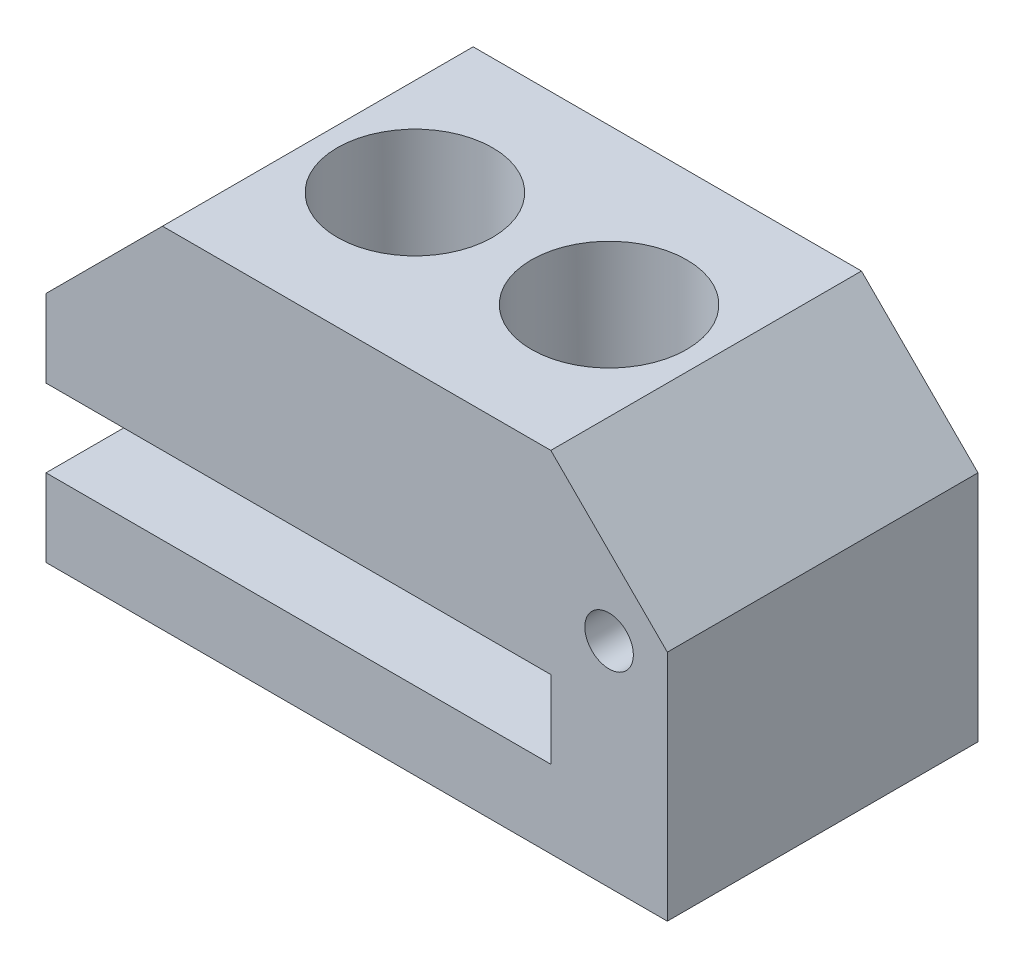
ISO-10303-21;
HEADER;
FILE_DESCRIPTION(('STEP AP214'),'2;1');
FILE_NAME('part.step','',(''),(''),'','','');
FILE_SCHEMA(('AUTOMOTIVE_DESIGN { 1 0 10303 214 1 1 1 1 }'));
ENDSEC;
DATA;
#1=APPLICATION_CONTEXT('core data for automotive mechanical design processes');
#2=APPLICATION_PROTOCOL_DEFINITION('international standard','automotive_design',2000,#1);
#3=PRODUCT_CONTEXT('',#1,'mechanical');
#4=PRODUCT('Part','Part','',(#3));
#5=PRODUCT_RELATED_PRODUCT_CATEGORY('part','',(#4));
#6=PRODUCT_DEFINITION_FORMATION('','',#4);
#7=PRODUCT_DEFINITION_CONTEXT('part definition',#1,'design');
#8=PRODUCT_DEFINITION('design','',#6,#7);
#9=PRODUCT_DEFINITION_SHAPE('','',#8);
#10=(LENGTH_UNIT() NAMED_UNIT(*) SI_UNIT(.MILLI.,.METRE.));
#11=(NAMED_UNIT(*) PLANE_ANGLE_UNIT() SI_UNIT($,.RADIAN.));
#12=(NAMED_UNIT(*) SI_UNIT($,.STERADIAN.) SOLID_ANGLE_UNIT());
#13=UNCERTAINTY_MEASURE_WITH_UNIT(LENGTH_MEASURE(1.E-05),#10,'distance_accuracy_value','');
#14=(GEOMETRIC_REPRESENTATION_CONTEXT(3) GLOBAL_UNCERTAINTY_ASSIGNED_CONTEXT((#13)) GLOBAL_UNIT_ASSIGNED_CONTEXT((#10,
#11,#12)) REPRESENTATION_CONTEXT('',''));
#15=CARTESIAN_POINT('',(0.,0.,0.));
#16=DIRECTION('',(0.,0.,1.));
#17=DIRECTION('',(1.,0.,0.));
#18=AXIS2_PLACEMENT_3D('',#15,#16,#17);
#19=CARTESIAN_POINT('',(0.,12.,16.));
#20=DIRECTION('',(1.,0.,0.));
#21=DIRECTION('',(0.,0.,-1.));
#22=AXIS2_PLACEMENT_3D('',#19,#20,#21);
#23=PLANE('',#22);
#24=DIRECTION('',(0.,0.,1.));
#25=VECTOR('',#24,1.);
#26=CARTESIAN_POINT('',(0.,4.,-40.));
#27=LINE('',#26,#25);
#28=CARTESIAN_POINT('',(0.,4.,0.));
#29=VERTEX_POINT('',#28);
#30=CARTESIAN_POINT('',(0.,4.,16.));
#31=VERTEX_POINT('',#30);
#32=EDGE_CURVE('E236',#29,#31,#27,.T.);
#33=ORIENTED_EDGE('',*,*,#32,.F.);
#34=DIRECTION('',(0.,-1.,0.));
#35=VECTOR('',#34,1.);
#36=CARTESIAN_POINT('',(0.,12.,0.));
#37=LINE('',#36,#35);
#38=CARTESIAN_POINT('',(0.,0.,0.));
#39=VERTEX_POINT('',#38);
#40=EDGE_CURVE('E145',#29,#39,#37,.T.);
#41=ORIENTED_EDGE('',*,*,#40,.T.);
#42=DIRECTION('',(0.,0.,-1.));
#43=VECTOR('',#42,1.);
#44=CARTESIAN_POINT('',(0.,0.,16.));
#45=LINE('',#44,#43);
#46=CARTESIAN_POINT('',(0.,0.,16.));
#47=VERTEX_POINT('',#46);
#48=EDGE_CURVE('E49',#47,#39,#45,.T.);
#49=ORIENTED_EDGE('',*,*,#48,.F.);
#50=DIRECTION('',(0.,-1.,0.));
#51=VECTOR('',#50,1.);
#52=CARTESIAN_POINT('',(0.,12.,16.));
#53=LINE('',#52,#51);
#54=EDGE_CURVE('E101',#31,#47,#53,.T.);
#55=ORIENTED_EDGE('',*,*,#54,.F.);
#56=EDGE_LOOP('',(#33,#41,#49,#55));
#57=FACE_BOUND('',#56,.T.);
#58=ADVANCED_FACE('F41',(#57),#23,.F.);
#59=CARTESIAN_POINT('',(21.,-40.,8.));
#60=DIRECTION('',(0.,1.,0.));
#61=DIRECTION('',(0.,0.,1.));
#62=AXIS2_PLACEMENT_3D('',#59,#60,#61);
#63=CYLINDRICAL_SURFACE('',#62,4.);
#64=CARTESIAN_POINT('',(21.,8.,8.));
#65=DIRECTION('',(0.,1.,0.));
#66=DIRECTION('',(0.,0.,1.));
#67=AXIS2_PLACEMENT_3D('',#64,#65,#66);
#68=CIRCLE('',#67,4.);
#69=CARTESIAN_POINT('',(21.,8.,12.));
#70=VERTEX_POINT('',#69);
#71=EDGE_CURVE('E178',#70,#70,#68,.F.);
#72=ORIENTED_EDGE('',*,*,#71,.T.);
#73=EDGE_LOOP('',(#72));
#74=FACE_BOUND('',#73,.T.);
#75=CARTESIAN_POINT('',(21.,18.,8.));
#76=DIRECTION('',(0.,-1.,0.));
#77=DIRECTION('',(0.,0.,-1.));
#78=AXIS2_PLACEMENT_3D('',#75,#76,#77);
#79=CIRCLE('',#78,4.);
#80=CARTESIAN_POINT('',(21.,18.,4.));
#81=VERTEX_POINT('',#80);
#82=EDGE_CURVE('E159',#81,#81,#79,.T.);
#83=ORIENTED_EDGE('',*,*,#82,.F.);
#84=EDGE_LOOP('',(#83));
#85=FACE_BOUND('',#84,.T.);
#86=ADVANCED_FACE('F269',(#74,#85),#63,.F.);
#87=CARTESIAN_POINT('',(11.,-40.,8.));
#88=DIRECTION('',(0.,1.,0.));
#89=DIRECTION('',(0.,0.,1.));
#90=AXIS2_PLACEMENT_3D('',#87,#88,#89);
#91=CYLINDRICAL_SURFACE('',#90,4.);
#92=CARTESIAN_POINT('',(11.,8.,8.));
#93=DIRECTION('',(0.,1.,0.));
#94=DIRECTION('',(0.,0.,1.));
#95=AXIS2_PLACEMENT_3D('',#92,#93,#94);
#96=CIRCLE('',#95,4.);
#97=CARTESIAN_POINT('',(11.,8.,12.));
#98=VERTEX_POINT('',#97);
#99=EDGE_CURVE('E173',#98,#98,#96,.F.);
#100=ORIENTED_EDGE('',*,*,#99,.T.);
#101=EDGE_LOOP('',(#100));
#102=FACE_BOUND('',#101,.T.);
#103=CARTESIAN_POINT('',(11.,18.,8.));
#104=DIRECTION('',(0.,-1.,0.));
#105=DIRECTION('',(0.,0.,-1.));
#106=AXIS2_PLACEMENT_3D('',#103,#104,#105);
#107=CIRCLE('',#106,4.);
#108=CARTESIAN_POINT('',(11.,18.,4.));
#109=VERTEX_POINT('',#108);
#110=EDGE_CURVE('E164',#109,#109,#107,.T.);
#111=ORIENTED_EDGE('',*,*,#110,.F.);
#112=EDGE_LOOP('',(#111));
#113=FACE_BOUND('',#112,.T.);
#114=ADVANCED_FACE('F274',(#102,#113),#91,.F.);
#115=CARTESIAN_POINT('',(0.,12.,0.));
#116=VERTEX_POINT('',#115);
#117=CARTESIAN_POINT('',(0.,8.,0.));
#118=VERTEX_POINT('',#117);
#119=EDGE_CURVE('E137',#116,#118,#37,.T.);
#120=ORIENTED_EDGE('',*,*,#119,.T.);
#121=DIRECTION('',(0.,0.,1.));
#122=VECTOR('',#121,1.);
#123=CARTESIAN_POINT('',(0.,8.,-40.));
#124=LINE('',#123,#122);
#125=CARTESIAN_POINT('',(0.,8.,16.));
#126=VERTEX_POINT('',#125);
#127=EDGE_CURVE('E174',#118,#126,#124,.T.);
#128=ORIENTED_EDGE('',*,*,#127,.T.);
#129=CARTESIAN_POINT('',(0.,12.,16.));
#130=VERTEX_POINT('',#129);
#131=EDGE_CURVE('E205',#130,#126,#53,.T.);
#132=ORIENTED_EDGE('',*,*,#131,.F.);
#133=DIRECTION('',(0.,0.,-1.));
#134=VECTOR('',#133,1.);
#135=CARTESIAN_POINT('',(0.,12.,16.));
#136=LINE('',#135,#134);
#137=EDGE_CURVE('E138',#130,#116,#136,.T.);
#138=ORIENTED_EDGE('',*,*,#137,.T.);
#139=EDGE_LOOP('',(#120,#128,#132,#138));
#140=FACE_BOUND('',#139,.T.);
#141=ADVANCED_FACE('F43',(#140),#23,.F.);
#142=CARTESIAN_POINT('',(0.,0.,16.));
#143=DIRECTION('',(0.,1.,0.));
#144=DIRECTION('',(0.,0.,1.));
#145=AXIS2_PLACEMENT_3D('',#142,#143,#144);
#146=PLANE('',#145);
#147=CARTESIAN_POINT('',(11.,0.,8.));
#148=DIRECTION('',(0.,1.,0.));
#149=DIRECTION('',(0.,0.,1.));
#150=AXIS2_PLACEMENT_3D('',#147,#148,#149);
#151=CIRCLE('',#150,4.);
#152=CARTESIAN_POINT('',(11.,0.,12.));
#153=VERTEX_POINT('',#152);
#154=EDGE_CURVE('E169',#153,#153,#151,.T.);
#155=ORIENTED_EDGE('',*,*,#154,.T.);
#156=EDGE_LOOP('',(#155));
#157=FACE_BOUND('',#156,.T.);
#158=CARTESIAN_POINT('',(21.,0.,8.));
#159=DIRECTION('',(0.,1.,0.));
#160=DIRECTION('',(0.,0.,1.));
#161=AXIS2_PLACEMENT_3D('',#158,#159,#160);
#162=CIRCLE('',#161,4.);
#163=CARTESIAN_POINT('',(21.,0.,12.));
#164=VERTEX_POINT('',#163);
#165=EDGE_CURVE('E162',#164,#164,#162,.T.);
#166=ORIENTED_EDGE('',*,*,#165,.T.);
#167=EDGE_LOOP('',(#166));
#168=FACE_BOUND('',#167,.T.);
#169=DIRECTION('',(1.,0.,0.));
#170=VECTOR('',#169,1.);
#171=CARTESIAN_POINT('',(0.,0.,0.));
#172=LINE('',#171,#170);
#173=CARTESIAN_POINT('',(32.,0.,0.));
#174=VERTEX_POINT('',#173);
#175=EDGE_CURVE('E141',#39,#174,#172,.T.);
#176=ORIENTED_EDGE('',*,*,#175,.T.);
#177=DIRECTION('',(0.,0.,-1.));
#178=VECTOR('',#177,1.);
#179=CARTESIAN_POINT('',(32.,0.,16.));
#180=LINE('',#179,#178);
#181=CARTESIAN_POINT('',(32.,0.,16.));
#182=VERTEX_POINT('',#181);
#183=EDGE_CURVE('E154',#182,#174,#180,.T.);
#184=ORIENTED_EDGE('',*,*,#183,.F.);
#185=DIRECTION('',(1.,0.,0.));
#186=VECTOR('',#185,1.);
#187=CARTESIAN_POINT('',(0.,0.,16.));
#188=LINE('',#187,#186);
#189=EDGE_CURVE('E204',#47,#182,#188,.T.);
#190=ORIENTED_EDGE('',*,*,#189,.F.);
#191=ORIENTED_EDGE('',*,*,#48,.T.);
#192=EDGE_LOOP('',(#176,#184,#190,#191));
#193=FACE_BOUND('',#192,.T.);
#194=ADVANCED_FACE('F208',(#157,#168,#193),#146,.F.);
#195=CARTESIAN_POINT('',(32.,0.,16.));
#196=DIRECTION('',(-1.,0.,0.));
#197=DIRECTION('',(0.,0.,1.));
#198=AXIS2_PLACEMENT_3D('',#195,#196,#197);
#199=PLANE('',#198);
#200=DIRECTION('',(0.,1.,0.));
#201=VECTOR('',#200,1.);
#202=CARTESIAN_POINT('',(32.,0.,0.));
#203=LINE('',#202,#201);
#204=CARTESIAN_POINT('',(32.,12.,0.));
#205=VERTEX_POINT('',#204);
#206=EDGE_CURVE('E148',#174,#205,#203,.T.);
#207=ORIENTED_EDGE('',*,*,#206,.T.);
#208=DIRECTION('',(0.,0.,-1.));
#209=VECTOR('',#208,1.);
#210=CARTESIAN_POINT('',(32.,12.,16.));
#211=LINE('',#210,#209);
#212=CARTESIAN_POINT('',(32.,12.,16.));
#213=VERTEX_POINT('',#212);
#214=EDGE_CURVE('E131',#213,#205,#211,.T.);
#215=ORIENTED_EDGE('',*,*,#214,.F.);
#216=DIRECTION('',(0.,1.,0.));
#217=VECTOR('',#216,1.);
#218=CARTESIAN_POINT('',(32.,0.,16.));
#219=LINE('',#218,#217);
#220=EDGE_CURVE('E118',#182,#213,#219,.T.);
#221=ORIENTED_EDGE('',*,*,#220,.F.);
#222=ORIENTED_EDGE('',*,*,#183,.T.);
#223=EDGE_LOOP('',(#207,#215,#221,#222));
#224=FACE_BOUND('',#223,.T.);
#225=ADVANCED_FACE('F215',(#224),#199,.F.);
#226=CARTESIAN_POINT('',(32.,12.,16.));
#227=DIRECTION('',(-0.707106781186547,-0.707106781186548,0.));
#228=DIRECTION('',(0.707106781186548,-0.707106781186547,0.));
#229=AXIS2_PLACEMENT_3D('',#226,#227,#228);
#230=PLANE('',#229);
#231=DIRECTION('',(-0.707106781186548,0.707106781186547,0.));
#232=VECTOR('',#231,1.);
#233=CARTESIAN_POINT('',(32.,12.,0.));
#234=LINE('',#233,#232);
#235=CARTESIAN_POINT('',(26.,18.,0.));
#236=VERTEX_POINT('',#235);
#237=EDGE_CURVE('E126',#205,#236,#234,.T.);
#238=ORIENTED_EDGE('',*,*,#237,.T.);
#239=DIRECTION('',(0.,0.,-1.));
#240=VECTOR('',#239,1.);
#241=CARTESIAN_POINT('',(26.,18.,16.));
#242=LINE('',#241,#240);
#243=CARTESIAN_POINT('',(26.,18.,16.));
#244=VERTEX_POINT('',#243);
#245=EDGE_CURVE('E122',#244,#236,#242,.T.);
#246=ORIENTED_EDGE('',*,*,#245,.F.);
#247=DIRECTION('',(-0.707106781186548,0.707106781186547,0.));
#248=VECTOR('',#247,1.);
#249=CARTESIAN_POINT('',(32.,12.,16.));
#250=LINE('',#249,#248);
#251=EDGE_CURVE('E112',#213,#244,#250,.T.);
#252=ORIENTED_EDGE('',*,*,#251,.F.);
#253=ORIENTED_EDGE('',*,*,#214,.T.);
#254=EDGE_LOOP('',(#238,#246,#252,#253));
#255=FACE_BOUND('',#254,.T.);
#256=ADVANCED_FACE('F127',(#255),#230,.F.);
#257=CARTESIAN_POINT('',(26.,18.,16.));
#258=DIRECTION('',(0.,-1.,0.));
#259=DIRECTION('',(0.,0.,-1.));
#260=AXIS2_PLACEMENT_3D('',#257,#258,#259);
#261=PLANE('',#260);
#262=ORIENTED_EDGE('',*,*,#110,.T.);
#263=EDGE_LOOP('',(#262));
#264=FACE_BOUND('',#263,.T.);
#265=ORIENTED_EDGE('',*,*,#82,.T.);
#266=EDGE_LOOP('',(#265));
#267=FACE_BOUND('',#266,.T.);
#268=DIRECTION('',(-1.,0.,0.));
#269=VECTOR('',#268,1.);
#270=CARTESIAN_POINT('',(26.,18.,0.));
#271=LINE('',#270,#269);
#272=CARTESIAN_POINT('',(6.,18.,0.));
#273=VERTEX_POINT('',#272);
#274=EDGE_CURVE('E149',#236,#273,#271,.T.);
#275=ORIENTED_EDGE('',*,*,#274,.T.);
#276=DIRECTION('',(0.,0.,-1.));
#277=VECTOR('',#276,1.);
#278=CARTESIAN_POINT('',(6.,18.,16.));
#279=LINE('',#278,#277);
#280=CARTESIAN_POINT('',(6.,18.,16.));
#281=VERTEX_POINT('',#280);
#282=EDGE_CURVE('E132',#281,#273,#279,.T.);
#283=ORIENTED_EDGE('',*,*,#282,.F.);
#284=DIRECTION('',(-1.,0.,0.));
#285=VECTOR('',#284,1.);
#286=CARTESIAN_POINT('',(26.,18.,16.));
#287=LINE('',#286,#285);
#288=EDGE_CURVE('E116',#244,#281,#287,.T.);
#289=ORIENTED_EDGE('',*,*,#288,.F.);
#290=ORIENTED_EDGE('',*,*,#245,.T.);
#291=EDGE_LOOP('',(#275,#283,#289,#290));
#292=FACE_BOUND('',#291,.T.);
#293=ADVANCED_FACE('F133',(#264,#267,#292),#261,.F.);
#294=CARTESIAN_POINT('',(6.,18.,16.));
#295=DIRECTION('',(0.707106781186547,-0.707106781186548,0.));
#296=DIRECTION('',(0.707106781186548,0.707106781186547,0.));
#297=AXIS2_PLACEMENT_3D('',#294,#295,#296);
#298=PLANE('',#297);
#299=DIRECTION('',(-0.707106781186548,-0.707106781186547,0.));
#300=VECTOR('',#299,1.);
#301=CARTESIAN_POINT('',(6.,18.,0.));
#302=LINE('',#301,#300);
#303=EDGE_CURVE('E91',#273,#116,#302,.T.);
#304=ORIENTED_EDGE('',*,*,#303,.T.);
#305=ORIENTED_EDGE('',*,*,#137,.F.);
#306=DIRECTION('',(-0.707106781186548,-0.707106781186547,0.));
#307=VECTOR('',#306,1.);
#308=CARTESIAN_POINT('',(6.,18.,16.));
#309=LINE('',#308,#307);
#310=EDGE_CURVE('E68',#281,#130,#309,.T.);
#311=ORIENTED_EDGE('',*,*,#310,.F.);
#312=ORIENTED_EDGE('',*,*,#282,.T.);
#313=EDGE_LOOP('',(#304,#305,#311,#312));
#314=FACE_BOUND('',#313,.T.);
#315=ADVANCED_FACE('F216',(#314),#298,.F.);
#316=CARTESIAN_POINT('',(0.,0.,16.));
#317=DIRECTION('',(0.,0.,1.));
#318=DIRECTION('',(1.,0.,0.));
#319=AXIS2_PLACEMENT_3D('',#316,#317,#318);
#320=PLANE('',#319);
#321=CARTESIAN_POINT('',(29.,11.,16.));
#322=DIRECTION('',(0.,0.,1.));
#323=DIRECTION('',(1.,0.,0.));
#324=AXIS2_PLACEMENT_3D('',#321,#322,#323);
#325=CIRCLE('',#324,1.25);
#326=CARTESIAN_POINT('',(30.25,11.,16.));
#327=VERTEX_POINT('',#326);
#328=EDGE_CURVE('E241',#327,#327,#325,.T.);
#329=ORIENTED_EDGE('',*,*,#328,.F.);
#330=EDGE_LOOP('',(#329));
#331=FACE_BOUND('',#330,.T.);
#332=DIRECTION('',(-1.,0.,0.));
#333=VECTOR('',#332,1.);
#334=CARTESIAN_POINT('',(0.,8.,16.));
#335=LINE('',#334,#333);
#336=CARTESIAN_POINT('',(26.,8.,16.));
#337=VERTEX_POINT('',#336);
#338=EDGE_CURVE('E191',#337,#126,#335,.T.);
#339=ORIENTED_EDGE('',*,*,#338,.F.);
#340=DIRECTION('',(0.,1.,0.));
#341=VECTOR('',#340,1.);
#342=CARTESIAN_POINT('',(26.,0.,16.));
#343=LINE('',#342,#341);
#344=CARTESIAN_POINT('',(26.,4.,16.));
#345=VERTEX_POINT('',#344);
#346=EDGE_CURVE('E163',#345,#337,#343,.T.);
#347=ORIENTED_EDGE('',*,*,#346,.F.);
#348=DIRECTION('',(1.,0.,0.));
#349=VECTOR('',#348,1.);
#350=CARTESIAN_POINT('',(0.,4.,16.));
#351=LINE('',#350,#349);
#352=EDGE_CURVE('E180',#31,#345,#351,.T.);
#353=ORIENTED_EDGE('',*,*,#352,.F.);
#354=ORIENTED_EDGE('',*,*,#54,.T.);
#355=ORIENTED_EDGE('',*,*,#189,.T.);
#356=ORIENTED_EDGE('',*,*,#220,.T.);
#357=ORIENTED_EDGE('',*,*,#251,.T.);
#358=ORIENTED_EDGE('',*,*,#288,.T.);
#359=ORIENTED_EDGE('',*,*,#310,.T.);
#360=ORIENTED_EDGE('',*,*,#131,.T.);
#361=EDGE_LOOP('',(#339,#347,#353,#354,#355,#356,#357,#358,#359,#360));
#362=FACE_BOUND('',#361,.T.);
#363=ADVANCED_FACE('F111',(#331,#362),#320,.T.);
#364=CARTESIAN_POINT('',(0.,0.,0.));
#365=DIRECTION('',(0.,0.,1.));
#366=DIRECTION('',(1.,0.,0.));
#367=AXIS2_PLACEMENT_3D('',#364,#365,#366);
#368=PLANE('',#367);
#369=CARTESIAN_POINT('',(29.,11.,0.));
#370=DIRECTION('',(0.,0.,1.));
#371=DIRECTION('',(1.,0.,0.));
#372=AXIS2_PLACEMENT_3D('',#369,#370,#371);
#373=CIRCLE('',#372,1.25);
#374=CARTESIAN_POINT('',(30.25,11.,0.));
#375=VERTEX_POINT('',#374);
#376=EDGE_CURVE('E44',#375,#375,#373,.T.);
#377=ORIENTED_EDGE('',*,*,#376,.T.);
#378=EDGE_LOOP('',(#377));
#379=FACE_BOUND('',#378,.T.);
#380=DIRECTION('',(0.,1.,0.));
#381=VECTOR('',#380,1.);
#382=CARTESIAN_POINT('',(26.,0.,0.));
#383=LINE('',#382,#381);
#384=CARTESIAN_POINT('',(26.,4.,0.));
#385=VERTEX_POINT('',#384);
#386=CARTESIAN_POINT('',(26.,8.,0.));
#387=VERTEX_POINT('',#386);
#388=EDGE_CURVE('E11',#385,#387,#383,.T.);
#389=ORIENTED_EDGE('',*,*,#388,.T.);
#390=DIRECTION('',(-1.,0.,0.));
#391=VECTOR('',#390,1.);
#392=CARTESIAN_POINT('',(0.,8.,0.));
#393=LINE('',#392,#391);
#394=EDGE_CURVE('E182',#387,#118,#393,.T.);
#395=ORIENTED_EDGE('',*,*,#394,.T.);
#396=ORIENTED_EDGE('',*,*,#119,.F.);
#397=ORIENTED_EDGE('',*,*,#303,.F.);
#398=ORIENTED_EDGE('',*,*,#274,.F.);
#399=ORIENTED_EDGE('',*,*,#237,.F.);
#400=ORIENTED_EDGE('',*,*,#206,.F.);
#401=ORIENTED_EDGE('',*,*,#175,.F.);
#402=ORIENTED_EDGE('',*,*,#40,.F.);
#403=DIRECTION('',(1.,0.,0.));
#404=VECTOR('',#403,1.);
#405=CARTESIAN_POINT('',(0.,4.,0.));
#406=LINE('',#405,#404);
#407=EDGE_CURVE('E181',#29,#385,#406,.T.);
#408=ORIENTED_EDGE('',*,*,#407,.T.);
#409=EDGE_LOOP('',(#389,#395,#396,#397,#398,#399,#400,#401,#402,#408));
#410=FACE_BOUND('',#409,.T.);
#411=ADVANCED_FACE('F212',(#379,#410),#368,.F.);
#412=CARTESIAN_POINT('',(21.,4.,8.));
#413=DIRECTION('',(0.,-1.,0.));
#414=DIRECTION('',(0.,0.,-1.));
#415=AXIS2_PLACEMENT_3D('',#412,#413,#414);
#416=CIRCLE('',#415,4.);
#417=CARTESIAN_POINT('',(21.,4.,4.));
#418=VERTEX_POINT('',#417);
#419=EDGE_CURVE('E172',#418,#418,#416,.F.);
#420=ORIENTED_EDGE('',*,*,#419,.T.);
#421=EDGE_LOOP('',(#420));
#422=FACE_BOUND('',#421,.T.);
#423=ORIENTED_EDGE('',*,*,#165,.F.);
#424=EDGE_LOOP('',(#423));
#425=FACE_BOUND('',#424,.T.);
#426=ADVANCED_FACE('F253',(#422,#425),#63,.F.);
#427=CARTESIAN_POINT('',(11.,4.,8.));
#428=DIRECTION('',(0.,-1.,0.));
#429=DIRECTION('',(0.,0.,-1.));
#430=AXIS2_PLACEMENT_3D('',#427,#428,#429);
#431=CIRCLE('',#430,4.);
#432=CARTESIAN_POINT('',(11.,4.,4.));
#433=VERTEX_POINT('',#432);
#434=EDGE_CURVE('E166',#433,#433,#431,.F.);
#435=ORIENTED_EDGE('',*,*,#434,.T.);
#436=EDGE_LOOP('',(#435));
#437=FACE_BOUND('',#436,.T.);
#438=ORIENTED_EDGE('',*,*,#154,.F.);
#439=EDGE_LOOP('',(#438));
#440=FACE_BOUND('',#439,.T.);
#441=ADVANCED_FACE('F285',(#437,#440),#91,.F.);
#442=CARTESIAN_POINT('',(26.,4.,-40.));
#443=DIRECTION('',(1.,0.,0.));
#444=DIRECTION('',(0.,0.,-1.));
#445=AXIS2_PLACEMENT_3D('',#442,#443,#444);
#446=PLANE('',#445);
#447=ORIENTED_EDGE('',*,*,#346,.T.);
#448=DIRECTION('',(0.,0.,1.));
#449=VECTOR('',#448,1.);
#450=CARTESIAN_POINT('',(26.,8.,-40.));
#451=LINE('',#450,#449);
#452=EDGE_CURVE('E244',#387,#337,#451,.T.);
#453=ORIENTED_EDGE('',*,*,#452,.F.);
#454=ORIENTED_EDGE('',*,*,#388,.F.);
#455=DIRECTION('',(0.,0.,1.));
#456=VECTOR('',#455,1.);
#457=CARTESIAN_POINT('',(26.,4.,-40.));
#458=LINE('',#457,#456);
#459=EDGE_CURVE('E60',#385,#345,#458,.T.);
#460=ORIENTED_EDGE('',*,*,#459,.T.);
#461=EDGE_LOOP('',(#447,#453,#454,#460));
#462=FACE_BOUND('',#461,.T.);
#463=ADVANCED_FACE('F264',(#462),#446,.F.);
#464=CARTESIAN_POINT('',(26.,8.,-40.));
#465=DIRECTION('',(0.,1.,0.));
#466=DIRECTION('',(0.,0.,1.));
#467=AXIS2_PLACEMENT_3D('',#464,#465,#466);
#468=PLANE('',#467);
#469=ORIENTED_EDGE('',*,*,#338,.T.);
#470=ORIENTED_EDGE('',*,*,#127,.F.);
#471=ORIENTED_EDGE('',*,*,#394,.F.);
#472=ORIENTED_EDGE('',*,*,#452,.T.);
#473=EDGE_LOOP('',(#469,#470,#471,#472));
#474=FACE_BOUND('',#473,.T.);
#475=ORIENTED_EDGE('',*,*,#99,.F.);
#476=EDGE_LOOP('',(#475));
#477=FACE_BOUND('',#476,.T.);
#478=ORIENTED_EDGE('',*,*,#71,.F.);
#479=EDGE_LOOP('',(#478));
#480=FACE_BOUND('',#479,.T.);
#481=ADVANCED_FACE('F258',(#474,#477,#480),#468,.F.);
#482=CARTESIAN_POINT('',(0.,4.,-40.));
#483=DIRECTION('',(0.,-1.,0.));
#484=DIRECTION('',(0.,0.,-1.));
#485=AXIS2_PLACEMENT_3D('',#482,#483,#484);
#486=PLANE('',#485);
#487=ORIENTED_EDGE('',*,*,#352,.T.);
#488=ORIENTED_EDGE('',*,*,#459,.F.);
#489=ORIENTED_EDGE('',*,*,#407,.F.);
#490=ORIENTED_EDGE('',*,*,#32,.T.);
#491=EDGE_LOOP('',(#487,#488,#489,#490));
#492=FACE_BOUND('',#491,.T.);
#493=ORIENTED_EDGE('',*,*,#434,.F.);
#494=EDGE_LOOP('',(#493));
#495=FACE_BOUND('',#494,.T.);
#496=ORIENTED_EDGE('',*,*,#419,.F.);
#497=EDGE_LOOP('',(#496));
#498=FACE_BOUND('',#497,.T.);
#499=ADVANCED_FACE('F237',(#492,#495,#498),#486,.F.);
#500=CARTESIAN_POINT('',(29.,11.,-40.));
#501=DIRECTION('',(0.,0.,1.));
#502=DIRECTION('',(1.,0.,0.));
#503=AXIS2_PLACEMENT_3D('',#500,#501,#502);
#504=CYLINDRICAL_SURFACE('',#503,1.25);
#505=ORIENTED_EDGE('',*,*,#328,.T.);
#506=EDGE_LOOP('',(#505));
#507=FACE_BOUND('',#506,.T.);
#508=ORIENTED_EDGE('',*,*,#376,.F.);
#509=EDGE_LOOP('',(#508));
#510=FACE_BOUND('',#509,.T.);
#511=ADVANCED_FACE('F254',(#507,#510),#504,.F.);
#512=CLOSED_SHELL('',(#58,#86,#114,#141,#194,#225,#256,#293,#315,#363,#411,#426,#441,#463,#481,
#499,#511));
#513=MANIFOLD_SOLID_BREP('B2',#512);
#514=ADVANCED_BREP_SHAPE_REPRESENTATION('',(#18,#513),#14);
#515=SHAPE_DEFINITION_REPRESENTATION(#9,#514);
ENDSEC;
END-ISO-10303-21;
